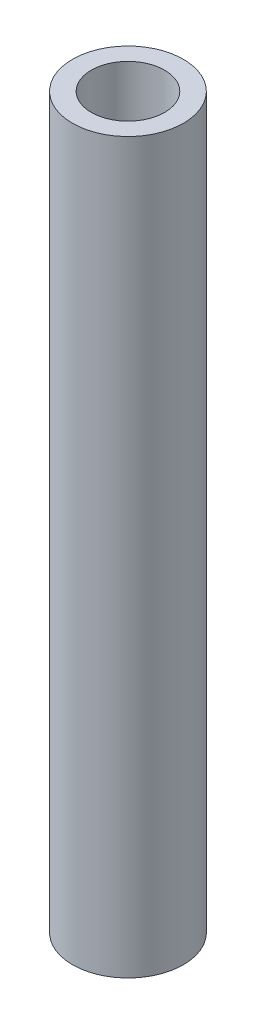
ISO-10303-21;
HEADER;
FILE_DESCRIPTION(('STEP AP214'),'2;1');
FILE_NAME('part.step','',(''),(''),'','','');
FILE_SCHEMA(('AUTOMOTIVE_DESIGN { 1 0 10303 214 1 1 1 1 }'));
ENDSEC;
DATA;
#1=APPLICATION_CONTEXT('core data for automotive mechanical design processes');
#2=APPLICATION_PROTOCOL_DEFINITION('international standard','automotive_design',2000,#1);
#3=PRODUCT_CONTEXT('',#1,'mechanical');
#4=PRODUCT('Part','Part','',(#3));
#5=PRODUCT_RELATED_PRODUCT_CATEGORY('part','',(#4));
#6=PRODUCT_DEFINITION_FORMATION('','',#4);
#7=PRODUCT_DEFINITION_CONTEXT('part definition',#1,'design');
#8=PRODUCT_DEFINITION('design','',#6,#7);
#9=PRODUCT_DEFINITION_SHAPE('','',#8);
#10=(LENGTH_UNIT() NAMED_UNIT(*) SI_UNIT(.MILLI.,.METRE.));
#11=(NAMED_UNIT(*) PLANE_ANGLE_UNIT() SI_UNIT($,.RADIAN.));
#12=(NAMED_UNIT(*) SI_UNIT($,.STERADIAN.) SOLID_ANGLE_UNIT());
#13=UNCERTAINTY_MEASURE_WITH_UNIT(LENGTH_MEASURE(1.E-05),#10,'distance_accuracy_value','');
#14=(GEOMETRIC_REPRESENTATION_CONTEXT(3) GLOBAL_UNCERTAINTY_ASSIGNED_CONTEXT((#13)) GLOBAL_UNIT_ASSIGNED_CONTEXT((#10,
#11,#12)) REPRESENTATION_CONTEXT('',''));
#15=CARTESIAN_POINT('',(0.,0.,0.));
#16=DIRECTION('',(0.,0.,1.));
#17=DIRECTION('',(1.,0.,0.));
#18=AXIS2_PLACEMENT_3D('',#15,#16,#17);
#19=CARTESIAN_POINT('',(0.,-70.6657900270019,0.));
#20=DIRECTION('',(0.,1.,0.));
#21=DIRECTION('',(0.,0.,1.));
#22=AXIS2_PLACEMENT_3D('',#19,#20,#21);
#23=CYLINDRICAL_SURFACE('',#22,4.425);
#24=CARTESIAN_POINT('',(0.,-58.15,0.));
#25=DIRECTION('',(0.,1.,0.));
#26=DIRECTION('',(0.,0.,1.));
#27=AXIS2_PLACEMENT_3D('',#24,#25,#26);
#28=CIRCLE('',#27,4.425);
#29=CARTESIAN_POINT('',(0.,-58.15,4.425));
#30=VERTEX_POINT('',#29);
#31=EDGE_CURVE('E54',#30,#30,#28,.F.);
#32=ORIENTED_EDGE('',*,*,#31,.F.);
#33=EDGE_LOOP('',(#32));
#34=FACE_BOUND('',#33,.T.);
#35=CARTESIAN_POINT('',(0.,0.,0.));
#36=DIRECTION('',(0.,1.,0.));
#37=DIRECTION('',(0.,0.,1.));
#38=AXIS2_PLACEMENT_3D('',#35,#36,#37);
#39=CIRCLE('',#38,4.425);
#40=CARTESIAN_POINT('',(0.,0.,4.425));
#41=VERTEX_POINT('',#40);
#42=EDGE_CURVE('E61',#41,#41,#39,.T.);
#43=ORIENTED_EDGE('',*,*,#42,.F.);
#44=EDGE_LOOP('',(#43));
#45=FACE_BOUND('',#44,.T.);
#46=ADVANCED_FACE('F47',(#34,#45),#23,.T.);
#47=CARTESIAN_POINT('',(0.,0.,0.));
#48=DIRECTION('',(0.,1.,0.));
#49=DIRECTION('',(0.,0.,1.));
#50=AXIS2_PLACEMENT_3D('',#47,#48,#49);
#51=PLANE('',#50);
#52=CARTESIAN_POINT('',(0.,0.,0.));
#53=DIRECTION('',(0.,1.,0.));
#54=DIRECTION('',(0.,0.,1.));
#55=AXIS2_PLACEMENT_3D('',#52,#53,#54);
#56=CIRCLE('',#55,2.925);
#57=CARTESIAN_POINT('',(0.,0.,2.925));
#58=VERTEX_POINT('',#57);
#59=EDGE_CURVE('E68',#58,#58,#56,.T.);
#60=ORIENTED_EDGE('',*,*,#59,.F.);
#61=EDGE_LOOP('',(#60));
#62=FACE_BOUND('',#61,.T.);
#63=ORIENTED_EDGE('',*,*,#42,.T.);
#64=EDGE_LOOP('',(#63));
#65=FACE_BOUND('',#64,.T.);
#66=ADVANCED_FACE('F76',(#62,#65),#51,.T.);
#67=CARTESIAN_POINT('',(0.,-70.6657900270019,0.));
#68=DIRECTION('',(0.,1.,0.));
#69=DIRECTION('',(0.,0.,1.));
#70=AXIS2_PLACEMENT_3D('',#67,#68,#69);
#71=CYLINDRICAL_SURFACE('',#70,2.925);
#72=CARTESIAN_POINT('',(0.,-58.15,0.));
#73=DIRECTION('',(0.,1.,0.));
#74=DIRECTION('',(0.,0.,1.));
#75=AXIS2_PLACEMENT_3D('',#72,#73,#74);
#76=CIRCLE('',#75,2.925);
#77=CARTESIAN_POINT('',(0.,-58.15,2.925));
#78=VERTEX_POINT('',#77);
#79=EDGE_CURVE('E10',#78,#78,#76,.F.);
#80=ORIENTED_EDGE('',*,*,#79,.T.);
#81=EDGE_LOOP('',(#80));
#82=FACE_BOUND('',#81,.T.);
#83=ORIENTED_EDGE('',*,*,#59,.T.);
#84=EDGE_LOOP('',(#83));
#85=FACE_BOUND('',#84,.T.);
#86=ADVANCED_FACE('F74',(#82,#85),#71,.F.);
#87=CARTESIAN_POINT('',(0.,-58.15,0.));
#88=DIRECTION('',(0.,1.,0.));
#89=DIRECTION('',(0.723200677621831,0.,-0.690637951380696));
#90=AXIS2_PLACEMENT_3D('',#87,#88,#89);
#91=PLANE('',#90);
#92=ORIENTED_EDGE('',*,*,#31,.T.);
#93=EDGE_LOOP('',(#92));
#94=FACE_BOUND('',#93,.T.);
#95=ORIENTED_EDGE('',*,*,#79,.F.);
#96=EDGE_LOOP('',(#95));
#97=FACE_BOUND('',#96,.T.);
#98=ADVANCED_FACE('F92',(#94,#97),#91,.F.);
#99=CLOSED_SHELL('',(#46,#66,#86,#98));
#100=MANIFOLD_SOLID_BREP('B2',#99);
#101=ADVANCED_BREP_SHAPE_REPRESENTATION('',(#18,#100),#14);
#102=SHAPE_DEFINITION_REPRESENTATION(#9,#101);
ENDSEC;
END-ISO-10303-21;
